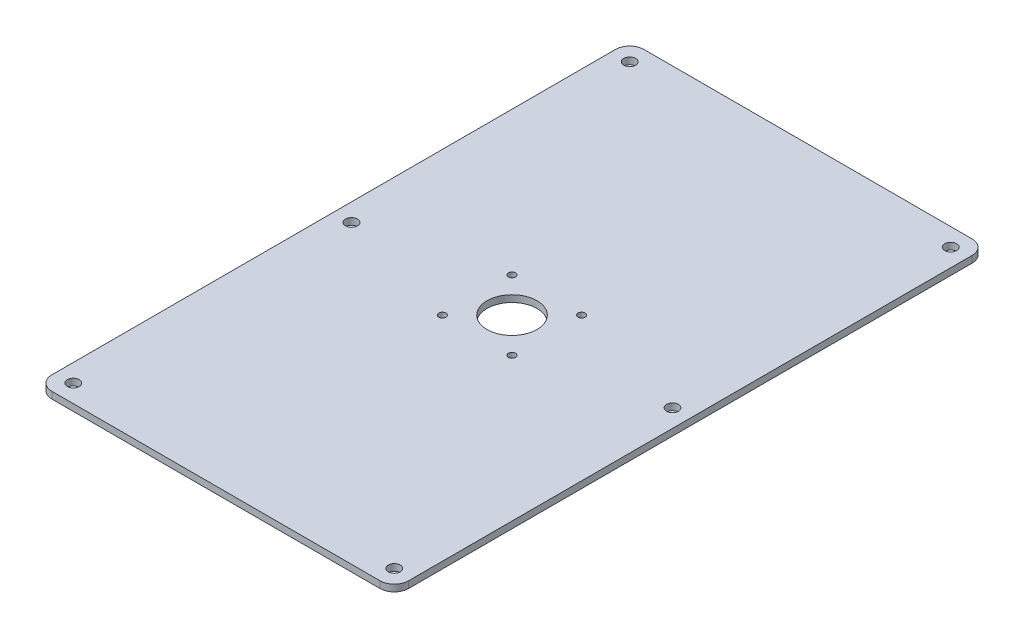
ISO-10303-21;
HEADER;
FILE_DESCRIPTION(('STEP AP214'),'2;1');
FILE_NAME('part.step','',(''),(''),'','','');
FILE_SCHEMA(('AUTOMOTIVE_DESIGN { 1 0 10303 214 1 1 1 1 }'));
ENDSEC;
DATA;
#1=APPLICATION_CONTEXT('core data for automotive mechanical design processes');
#2=APPLICATION_PROTOCOL_DEFINITION('international standard','automotive_design',2000,#1);
#3=PRODUCT_CONTEXT('',#1,'mechanical');
#4=PRODUCT('Part','Part','',(#3));
#5=PRODUCT_RELATED_PRODUCT_CATEGORY('part','',(#4));
#6=PRODUCT_DEFINITION_FORMATION('','',#4);
#7=PRODUCT_DEFINITION_CONTEXT('part definition',#1,'design');
#8=PRODUCT_DEFINITION('design','',#6,#7);
#9=PRODUCT_DEFINITION_SHAPE('','',#8);
#10=(LENGTH_UNIT() NAMED_UNIT(*) SI_UNIT(.MILLI.,.METRE.));
#11=(NAMED_UNIT(*) PLANE_ANGLE_UNIT() SI_UNIT($,.RADIAN.));
#12=(NAMED_UNIT(*) SI_UNIT($,.STERADIAN.) SOLID_ANGLE_UNIT());
#13=UNCERTAINTY_MEASURE_WITH_UNIT(LENGTH_MEASURE(1.E-05),#10,'distance_accuracy_value','');
#14=(GEOMETRIC_REPRESENTATION_CONTEXT(3) GLOBAL_UNCERTAINTY_ASSIGNED_CONTEXT((#13)) GLOBAL_UNIT_ASSIGNED_CONTEXT((#10,
#11,#12)) REPRESENTATION_CONTEXT('',''));
#15=CARTESIAN_POINT('',(0.,0.,0.));
#16=DIRECTION('',(0.,0.,1.));
#17=DIRECTION('',(1.,0.,0.));
#18=AXIS2_PLACEMENT_3D('',#15,#16,#17);
#19=CARTESIAN_POINT('',(0.,3.,0.));
#20=DIRECTION('',(0.,-1.,0.));
#21=DIRECTION('',(0.,0.,-1.));
#22=AXIS2_PLACEMENT_3D('',#19,#20,#21);
#23=PLANE('',#22);
#24=CARTESIAN_POINT('',(-15.5,3.,15.5));
#25=DIRECTION('',(0.,1.,0.));
#26=DIRECTION('',(0.,0.,1.));
#27=AXIS2_PLACEMENT_3D('',#24,#25,#26);
#28=CIRCLE('',#27,1.6);
#29=CARTESIAN_POINT('',(-15.5,3.,17.1));
#30=VERTEX_POINT('',#29);
#31=EDGE_CURVE('E210',#30,#30,#28,.T.);
#32=ORIENTED_EDGE('',*,*,#31,.F.);
#33=EDGE_LOOP('',(#32));
#34=FACE_BOUND('',#33,.T.);
#35=CARTESIAN_POINT('',(0.,3.,0.));
#36=DIRECTION('',(0.,1.,0.));
#37=DIRECTION('',(0.,0.,1.));
#38=AXIS2_PLACEMENT_3D('',#35,#36,#37);
#39=CIRCLE('',#38,11.1125);
#40=CARTESIAN_POINT('',(0.,3.,11.1125));
#41=VERTEX_POINT('',#40);
#42=EDGE_CURVE('E144',#41,#41,#39,.T.);
#43=ORIENTED_EDGE('',*,*,#42,.F.);
#44=EDGE_LOOP('',(#43));
#45=FACE_BOUND('',#44,.T.);
#46=DIRECTION('',(1.,0.,0.));
#47=VECTOR('',#46,1.);
#48=CARTESIAN_POINT('',(-79.375,3.,131.7625));
#49=LINE('',#48,#47);
#50=CARTESIAN_POINT('',(-73.025,3.,131.7625));
#51=VERTEX_POINT('',#50);
#52=CARTESIAN_POINT('',(73.0249999999999,3.,131.7625));
#53=VERTEX_POINT('',#52);
#54=EDGE_CURVE('E150',#51,#53,#49,.T.);
#55=ORIENTED_EDGE('',*,*,#54,.T.);
#56=CARTESIAN_POINT('',(73.025,3.,125.4125));
#57=DIRECTION('',(0.,-1.,0.));
#58=DIRECTION('',(0.,0.,-1.));
#59=AXIS2_PLACEMENT_3D('',#56,#57,#58);
#60=CIRCLE('',#59,6.35);
#61=CARTESIAN_POINT('',(79.375,3.,125.4125));
#62=VERTEX_POINT('',#61);
#63=EDGE_CURVE('E164',#53,#62,#60,.F.);
#64=ORIENTED_EDGE('',*,*,#63,.T.);
#65=DIRECTION('',(0.,0.,-1.));
#66=VECTOR('',#65,1.);
#67=CARTESIAN_POINT('',(79.375,3.,131.7625));
#68=LINE('',#67,#66);
#69=CARTESIAN_POINT('',(79.375,3.,-125.4125));
#70=VERTEX_POINT('',#69);
#71=EDGE_CURVE('E128',#62,#70,#68,.T.);
#72=ORIENTED_EDGE('',*,*,#71,.T.);
#73=CARTESIAN_POINT('',(73.025,3.,-125.4125));
#74=DIRECTION('',(0.,-1.,0.));
#75=DIRECTION('',(0.,0.,-1.));
#76=AXIS2_PLACEMENT_3D('',#73,#74,#75);
#77=CIRCLE('',#76,6.35);
#78=CARTESIAN_POINT('',(73.0249999999999,3.,-131.7625));
#79=VERTEX_POINT('',#78);
#80=EDGE_CURVE('E162',#70,#79,#77,.F.);
#81=ORIENTED_EDGE('',*,*,#80,.T.);
#82=DIRECTION('',(-1.,0.,0.));
#83=VECTOR('',#82,1.);
#84=CARTESIAN_POINT('',(-79.375,3.,-131.7625));
#85=LINE('',#84,#83);
#86=CARTESIAN_POINT('',(-73.025,3.,-131.7625));
#87=VERTEX_POINT('',#86);
#88=EDGE_CURVE('E176',#79,#87,#85,.T.);
#89=ORIENTED_EDGE('',*,*,#88,.T.);
#90=CARTESIAN_POINT('',(-73.025,3.,-125.4125));
#91=DIRECTION('',(0.,-1.,0.));
#92=DIRECTION('',(0.,0.,-1.));
#93=AXIS2_PLACEMENT_3D('',#90,#91,#92);
#94=CIRCLE('',#93,6.35);
#95=CARTESIAN_POINT('',(-79.375,3.,-125.4125));
#96=VERTEX_POINT('',#95);
#97=EDGE_CURVE('E69',#87,#96,#94,.F.);
#98=ORIENTED_EDGE('',*,*,#97,.T.);
#99=DIRECTION('',(0.,0.,1.));
#100=VECTOR('',#99,1.);
#101=CARTESIAN_POINT('',(-79.375,3.,131.7625));
#102=LINE('',#101,#100);
#103=CARTESIAN_POINT('',(-79.375,3.,125.4125));
#104=VERTEX_POINT('',#103);
#105=EDGE_CURVE('E183',#96,#104,#102,.T.);
#106=ORIENTED_EDGE('',*,*,#105,.T.);
#107=CARTESIAN_POINT('',(-73.025,3.,125.4125));
#108=DIRECTION('',(0.,-1.,0.));
#109=DIRECTION('',(0.,0.,-1.));
#110=AXIS2_PLACEMENT_3D('',#107,#108,#109);
#111=CIRCLE('',#110,6.35);
#112=EDGE_CURVE('E159',#104,#51,#111,.F.);
#113=ORIENTED_EDGE('',*,*,#112,.T.);
#114=EDGE_LOOP('',(#55,#64,#72,#81,#89,#98,#106,#113));
#115=FACE_BOUND('',#114,.T.);
#116=CARTESIAN_POINT('',(15.5,3.,15.5));
#117=DIRECTION('',(0.,1.,0.));
#118=DIRECTION('',(0.,0.,1.));
#119=AXIS2_PLACEMENT_3D('',#116,#117,#118);
#120=CIRCLE('',#119,1.6);
#121=CARTESIAN_POINT('',(15.5,3.,17.1));
#122=VERTEX_POINT('',#121);
#123=EDGE_CURVE('E193',#122,#122,#120,.T.);
#124=ORIENTED_EDGE('',*,*,#123,.F.);
#125=EDGE_LOOP('',(#124));
#126=FACE_BOUND('',#125,.T.);
#127=CARTESIAN_POINT('',(-15.5,3.,-15.5));
#128=DIRECTION('',(0.,1.,0.));
#129=DIRECTION('',(0.,0.,1.));
#130=AXIS2_PLACEMENT_3D('',#127,#128,#129);
#131=CIRCLE('',#130,1.6);
#132=CARTESIAN_POINT('',(-15.5,3.,-13.9));
#133=VERTEX_POINT('',#132);
#134=EDGE_CURVE('E202',#133,#133,#131,.T.);
#135=ORIENTED_EDGE('',*,*,#134,.F.);
#136=EDGE_LOOP('',(#135));
#137=FACE_BOUND('',#136,.T.);
#138=CARTESIAN_POINT('',(15.5,3.,-15.5));
#139=DIRECTION('',(0.,1.,0.));
#140=DIRECTION('',(0.,0.,1.));
#141=AXIS2_PLACEMENT_3D('',#138,#139,#140);
#142=CIRCLE('',#141,1.6);
#143=CARTESIAN_POINT('',(15.5,3.,-13.9));
#144=VERTEX_POINT('',#143);
#145=EDGE_CURVE('E214',#144,#144,#142,.T.);
#146=ORIENTED_EDGE('',*,*,#145,.F.);
#147=EDGE_LOOP('',(#146));
#148=FACE_BOUND('',#147,.T.);
#149=CARTESIAN_POINT('',(71.4375,3.,0.));
#150=DIRECTION('',(0.,1.,0.));
#151=DIRECTION('',(0.,0.,1.));
#152=AXIS2_PLACEMENT_3D('',#149,#150,#151);
#153=CIRCLE('',#152,2.65);
#154=CARTESIAN_POINT('',(71.4375,3.,2.65));
#155=VERTEX_POINT('',#154);
#156=EDGE_CURVE('E218',#155,#155,#153,.T.);
#157=ORIENTED_EDGE('',*,*,#156,.F.);
#158=EDGE_LOOP('',(#157));
#159=FACE_BOUND('',#158,.T.);
#160=CARTESIAN_POINT('',(-71.4375,3.,0.));
#161=DIRECTION('',(0.,1.,0.));
#162=DIRECTION('',(0.,0.,1.));
#163=AXIS2_PLACEMENT_3D('',#160,#161,#162);
#164=CIRCLE('',#163,2.65);
#165=CARTESIAN_POINT('',(-71.4375,3.,2.65));
#166=VERTEX_POINT('',#165);
#167=EDGE_CURVE('E224',#166,#166,#164,.T.);
#168=ORIENTED_EDGE('',*,*,#167,.F.);
#169=EDGE_LOOP('',(#168));
#170=FACE_BOUND('',#169,.T.);
#171=CARTESIAN_POINT('',(71.4375,3.,123.825));
#172=DIRECTION('',(0.,1.,0.));
#173=DIRECTION('',(0.,0.,1.));
#174=AXIS2_PLACEMENT_3D('',#171,#172,#173);
#175=CIRCLE('',#174,2.65);
#176=CARTESIAN_POINT('',(71.4375,3.,126.475));
#177=VERTEX_POINT('',#176);
#178=EDGE_CURVE('E233',#177,#177,#175,.T.);
#179=ORIENTED_EDGE('',*,*,#178,.F.);
#180=EDGE_LOOP('',(#179));
#181=FACE_BOUND('',#180,.T.);
#182=CARTESIAN_POINT('',(-71.4375,3.,-123.825));
#183=DIRECTION('',(0.,1.,0.));
#184=DIRECTION('',(0.,0.,1.));
#185=AXIS2_PLACEMENT_3D('',#182,#183,#184);
#186=CIRCLE('',#185,2.65);
#187=CARTESIAN_POINT('',(-71.4375,3.,-121.175));
#188=VERTEX_POINT('',#187);
#189=EDGE_CURVE('E240',#188,#188,#186,.T.);
#190=ORIENTED_EDGE('',*,*,#189,.F.);
#191=EDGE_LOOP('',(#190));
#192=FACE_BOUND('',#191,.T.);
#193=CARTESIAN_POINT('',(-71.4375,3.,123.825));
#194=DIRECTION('',(0.,1.,0.));
#195=DIRECTION('',(0.,0.,1.));
#196=AXIS2_PLACEMENT_3D('',#193,#194,#195);
#197=CIRCLE('',#196,2.65);
#198=CARTESIAN_POINT('',(-71.4375,3.,126.475));
#199=VERTEX_POINT('',#198);
#200=EDGE_CURVE('E243',#199,#199,#197,.T.);
#201=ORIENTED_EDGE('',*,*,#200,.F.);
#202=EDGE_LOOP('',(#201));
#203=FACE_BOUND('',#202,.T.);
#204=CARTESIAN_POINT('',(71.4375,3.,-123.825));
#205=DIRECTION('',(0.,1.,0.));
#206=DIRECTION('',(0.,0.,1.));
#207=AXIS2_PLACEMENT_3D('',#204,#205,#206);
#208=CIRCLE('',#207,2.65);
#209=CARTESIAN_POINT('',(71.4375,3.,-121.175));
#210=VERTEX_POINT('',#209);
#211=EDGE_CURVE('E248',#210,#210,#208,.T.);
#212=ORIENTED_EDGE('',*,*,#211,.F.);
#213=EDGE_LOOP('',(#212));
#214=FACE_BOUND('',#213,.T.);
#215=ADVANCED_FACE('F42',(#34,#45,#115,#126,#137,#148,#159,#170,#181,#192,#203,#214),#23,.F.);
#216=CARTESIAN_POINT('',(79.375,3.,131.7625));
#217=DIRECTION('',(-1.,0.,0.));
#218=DIRECTION('',(0.,0.,1.));
#219=AXIS2_PLACEMENT_3D('',#216,#217,#218);
#220=PLANE('',#219);
#221=ORIENTED_EDGE('',*,*,#71,.F.);
#222=DIRECTION('',(0.,-1.,0.));
#223=VECTOR('',#222,1.);
#224=CARTESIAN_POINT('',(79.375,3.,125.4125));
#225=LINE('',#224,#223);
#226=CARTESIAN_POINT('',(79.375,0.,125.4125));
#227=VERTEX_POINT('',#226);
#228=EDGE_CURVE('E112',#62,#227,#225,.T.);
#229=ORIENTED_EDGE('',*,*,#228,.T.);
#230=DIRECTION('',(0.,0.,-1.));
#231=VECTOR('',#230,1.);
#232=CARTESIAN_POINT('',(79.375,0.,131.7625));
#233=LINE('',#232,#231);
#234=CARTESIAN_POINT('',(79.375,0.,-125.4125));
#235=VERTEX_POINT('',#234);
#236=EDGE_CURVE('E130',#227,#235,#233,.T.);
#237=ORIENTED_EDGE('',*,*,#236,.T.);
#238=DIRECTION('',(0.,-1.,0.));
#239=VECTOR('',#238,1.);
#240=CARTESIAN_POINT('',(79.375,3.,-125.4125));
#241=LINE('',#240,#239);
#242=EDGE_CURVE('E131',#235,#70,#241,.F.);
#243=ORIENTED_EDGE('',*,*,#242,.T.);
#244=EDGE_LOOP('',(#221,#229,#237,#243));
#245=FACE_BOUND('',#244,.T.);
#246=ADVANCED_FACE('F127',(#245),#220,.F.);
#247=CARTESIAN_POINT('',(-79.375,3.,-131.7625));
#248=DIRECTION('',(0.,0.,1.));
#249=DIRECTION('',(1.,0.,0.));
#250=AXIS2_PLACEMENT_3D('',#247,#248,#249);
#251=PLANE('',#250);
#252=DIRECTION('',(-1.,0.,0.));
#253=VECTOR('',#252,1.);
#254=CARTESIAN_POINT('',(-79.375,0.,-131.7625));
#255=LINE('',#254,#253);
#256=CARTESIAN_POINT('',(73.0249999999999,0.,-131.7625));
#257=VERTEX_POINT('',#256);
#258=CARTESIAN_POINT('',(-73.025,0.,-131.7625));
#259=VERTEX_POINT('',#258);
#260=EDGE_CURVE('E140',#257,#259,#255,.T.);
#261=ORIENTED_EDGE('',*,*,#260,.T.);
#262=DIRECTION('',(0.,-1.,0.));
#263=VECTOR('',#262,1.);
#264=CARTESIAN_POINT('',(-73.025,3.,-131.7625));
#265=LINE('',#264,#263);
#266=EDGE_CURVE('E11',#259,#87,#265,.F.);
#267=ORIENTED_EDGE('',*,*,#266,.T.);
#268=ORIENTED_EDGE('',*,*,#88,.F.);
#269=DIRECTION('',(0.,-1.,0.));
#270=VECTOR('',#269,1.);
#271=CARTESIAN_POINT('',(73.025,3.,-131.7625));
#272=LINE('',#271,#270);
#273=EDGE_CURVE('E55',#79,#257,#272,.T.);
#274=ORIENTED_EDGE('',*,*,#273,.T.);
#275=EDGE_LOOP('',(#261,#267,#268,#274));
#276=FACE_BOUND('',#275,.T.);
#277=ADVANCED_FACE('F172',(#276),#251,.F.);
#278=CARTESIAN_POINT('',(-79.375,3.,131.7625));
#279=DIRECTION('',(1.,0.,0.));
#280=DIRECTION('',(0.,0.,-1.));
#281=AXIS2_PLACEMENT_3D('',#278,#279,#280);
#282=PLANE('',#281);
#283=ORIENTED_EDGE('',*,*,#105,.F.);
#284=DIRECTION('',(0.,-1.,0.));
#285=VECTOR('',#284,1.);
#286=CARTESIAN_POINT('',(-79.375,3.,-125.4125));
#287=LINE('',#286,#285);
#288=CARTESIAN_POINT('',(-79.375,0.,-125.4125));
#289=VERTEX_POINT('',#288);
#290=EDGE_CURVE('E166',#96,#289,#287,.T.);
#291=ORIENTED_EDGE('',*,*,#290,.T.);
#292=DIRECTION('',(0.,0.,1.));
#293=VECTOR('',#292,1.);
#294=CARTESIAN_POINT('',(-79.375,0.,131.7625));
#295=LINE('',#294,#293);
#296=CARTESIAN_POINT('',(-79.375,0.,125.4125));
#297=VERTEX_POINT('',#296);
#298=EDGE_CURVE('E142',#289,#297,#295,.T.);
#299=ORIENTED_EDGE('',*,*,#298,.T.);
#300=DIRECTION('',(0.,-1.,0.));
#301=VECTOR('',#300,1.);
#302=CARTESIAN_POINT('',(-79.375,3.,125.4125));
#303=LINE('',#302,#301);
#304=EDGE_CURVE('E56',#297,#104,#303,.F.);
#305=ORIENTED_EDGE('',*,*,#304,.T.);
#306=EDGE_LOOP('',(#283,#291,#299,#305));
#307=FACE_BOUND('',#306,.T.);
#308=ADVANCED_FACE('F182',(#307),#282,.F.);
#309=CARTESIAN_POINT('',(-79.375,3.,131.7625));
#310=DIRECTION('',(0.,0.,-1.));
#311=DIRECTION('',(-1.,0.,0.));
#312=AXIS2_PLACEMENT_3D('',#309,#310,#311);
#313=PLANE('',#312);
#314=DIRECTION('',(1.,0.,0.));
#315=VECTOR('',#314,1.);
#316=CARTESIAN_POINT('',(-79.375,0.,131.7625));
#317=LINE('',#316,#315);
#318=CARTESIAN_POINT('',(-73.025,0.,131.7625));
#319=VERTEX_POINT('',#318);
#320=CARTESIAN_POINT('',(73.0249999999999,0.,131.7625));
#321=VERTEX_POINT('',#320);
#322=EDGE_CURVE('E154',#319,#321,#317,.T.);
#323=ORIENTED_EDGE('',*,*,#322,.T.);
#324=DIRECTION('',(0.,-1.,0.));
#325=VECTOR('',#324,1.);
#326=CARTESIAN_POINT('',(73.025,3.,131.7625));
#327=LINE('',#326,#325);
#328=EDGE_CURVE('E114',#321,#53,#327,.F.);
#329=ORIENTED_EDGE('',*,*,#328,.T.);
#330=ORIENTED_EDGE('',*,*,#54,.F.);
#331=DIRECTION('',(0.,-1.,0.));
#332=VECTOR('',#331,1.);
#333=CARTESIAN_POINT('',(-73.025,3.,131.7625));
#334=LINE('',#333,#332);
#335=EDGE_CURVE('E119',#51,#319,#334,.T.);
#336=ORIENTED_EDGE('',*,*,#335,.T.);
#337=EDGE_LOOP('',(#323,#329,#330,#336));
#338=FACE_BOUND('',#337,.T.);
#339=ADVANCED_FACE('F275',(#338),#313,.F.);
#340=CARTESIAN_POINT('',(0.,0.,0.));
#341=DIRECTION('',(0.,-1.,0.));
#342=DIRECTION('',(0.,0.,-1.));
#343=AXIS2_PLACEMENT_3D('',#340,#341,#342);
#344=PLANE('',#343);
#345=CARTESIAN_POINT('',(71.4375,0.,-123.825));
#346=DIRECTION('',(0.,-1.,0.));
#347=DIRECTION('',(0.,0.,-1.));
#348=AXIS2_PLACEMENT_3D('',#345,#346,#347);
#349=CIRCLE('',#348,2.65);
#350=CARTESIAN_POINT('',(71.4375,0.,-126.475));
#351=VERTEX_POINT('',#350);
#352=EDGE_CURVE('E246',#351,#351,#349,.T.);
#353=ORIENTED_EDGE('',*,*,#352,.F.);
#354=EDGE_LOOP('',(#353));
#355=FACE_BOUND('',#354,.T.);
#356=CARTESIAN_POINT('',(-71.4375,0.,123.825));
#357=DIRECTION('',(0.,-1.,0.));
#358=DIRECTION('',(0.,0.,-1.));
#359=AXIS2_PLACEMENT_3D('',#356,#357,#358);
#360=CIRCLE('',#359,2.65);
#361=CARTESIAN_POINT('',(-71.4375,0.,121.175));
#362=VERTEX_POINT('',#361);
#363=EDGE_CURVE('E239',#362,#362,#360,.T.);
#364=ORIENTED_EDGE('',*,*,#363,.F.);
#365=EDGE_LOOP('',(#364));
#366=FACE_BOUND('',#365,.T.);
#367=CARTESIAN_POINT('',(-71.4375,0.,-123.825));
#368=DIRECTION('',(0.,-1.,0.));
#369=DIRECTION('',(0.,0.,-1.));
#370=AXIS2_PLACEMENT_3D('',#367,#368,#369);
#371=CIRCLE('',#370,2.65);
#372=CARTESIAN_POINT('',(-71.4375,0.,-126.475));
#373=VERTEX_POINT('',#372);
#374=EDGE_CURVE('E234',#373,#373,#371,.T.);
#375=ORIENTED_EDGE('',*,*,#374,.F.);
#376=EDGE_LOOP('',(#375));
#377=FACE_BOUND('',#376,.T.);
#378=CARTESIAN_POINT('',(71.4375,0.,123.825));
#379=DIRECTION('',(0.,-1.,0.));
#380=DIRECTION('',(0.,0.,-1.));
#381=AXIS2_PLACEMENT_3D('',#378,#379,#380);
#382=CIRCLE('',#381,2.65);
#383=CARTESIAN_POINT('',(71.4375,0.,121.175));
#384=VERTEX_POINT('',#383);
#385=EDGE_CURVE('E226',#384,#384,#382,.T.);
#386=ORIENTED_EDGE('',*,*,#385,.F.);
#387=EDGE_LOOP('',(#386));
#388=FACE_BOUND('',#387,.T.);
#389=CARTESIAN_POINT('',(-71.4375,0.,0.));
#390=DIRECTION('',(0.,-1.,0.));
#391=DIRECTION('',(0.,0.,-1.));
#392=AXIS2_PLACEMENT_3D('',#389,#390,#391);
#393=CIRCLE('',#392,2.65);
#394=CARTESIAN_POINT('',(-71.4375,0.,-2.65));
#395=VERTEX_POINT('',#394);
#396=EDGE_CURVE('E225',#395,#395,#393,.T.);
#397=ORIENTED_EDGE('',*,*,#396,.F.);
#398=EDGE_LOOP('',(#397));
#399=FACE_BOUND('',#398,.T.);
#400=CARTESIAN_POINT('',(71.4375,0.,0.));
#401=DIRECTION('',(0.,-1.,0.));
#402=DIRECTION('',(0.,0.,-1.));
#403=AXIS2_PLACEMENT_3D('',#400,#401,#402);
#404=CIRCLE('',#403,2.65);
#405=CARTESIAN_POINT('',(71.4375,0.,-2.65));
#406=VERTEX_POINT('',#405);
#407=EDGE_CURVE('E219',#406,#406,#404,.T.);
#408=ORIENTED_EDGE('',*,*,#407,.F.);
#409=EDGE_LOOP('',(#408));
#410=FACE_BOUND('',#409,.T.);
#411=CARTESIAN_POINT('',(15.5,0.,-15.5));
#412=DIRECTION('',(0.,-1.,0.));
#413=DIRECTION('',(0.,0.,-1.));
#414=AXIS2_PLACEMENT_3D('',#411,#412,#413);
#415=CIRCLE('',#414,1.6);
#416=CARTESIAN_POINT('',(15.5,0.,-17.1));
#417=VERTEX_POINT('',#416);
#418=EDGE_CURVE('E208',#417,#417,#415,.T.);
#419=ORIENTED_EDGE('',*,*,#418,.F.);
#420=EDGE_LOOP('',(#419));
#421=FACE_BOUND('',#420,.T.);
#422=CARTESIAN_POINT('',(-15.5,0.,15.5));
#423=DIRECTION('',(0.,-1.,0.));
#424=DIRECTION('',(0.,0.,-1.));
#425=AXIS2_PLACEMENT_3D('',#422,#423,#424);
#426=CIRCLE('',#425,1.6);
#427=CARTESIAN_POINT('',(-15.5,0.,13.9));
#428=VERTEX_POINT('',#427);
#429=EDGE_CURVE('E204',#428,#428,#426,.T.);
#430=ORIENTED_EDGE('',*,*,#429,.F.);
#431=EDGE_LOOP('',(#430));
#432=FACE_BOUND('',#431,.T.);
#433=CARTESIAN_POINT('',(-15.5,0.,-15.5));
#434=DIRECTION('',(0.,-1.,0.));
#435=DIRECTION('',(0.,0.,-1.));
#436=AXIS2_PLACEMENT_3D('',#433,#434,#435);
#437=CIRCLE('',#436,1.6);
#438=CARTESIAN_POINT('',(-15.5,0.,-17.1));
#439=VERTEX_POINT('',#438);
#440=EDGE_CURVE('E200',#439,#439,#437,.T.);
#441=ORIENTED_EDGE('',*,*,#440,.F.);
#442=EDGE_LOOP('',(#441));
#443=FACE_BOUND('',#442,.T.);
#444=CARTESIAN_POINT('',(15.5,0.,15.5));
#445=DIRECTION('',(0.,-1.,0.));
#446=DIRECTION('',(0.,0.,-1.));
#447=AXIS2_PLACEMENT_3D('',#444,#445,#446);
#448=CIRCLE('',#447,1.6);
#449=CARTESIAN_POINT('',(15.5,0.,13.9));
#450=VERTEX_POINT('',#449);
#451=EDGE_CURVE('E192',#450,#450,#448,.T.);
#452=ORIENTED_EDGE('',*,*,#451,.F.);
#453=EDGE_LOOP('',(#452));
#454=FACE_BOUND('',#453,.T.);
#455=CARTESIAN_POINT('',(0.,0.,0.));
#456=DIRECTION('',(0.,1.,0.));
#457=DIRECTION('',(0.,0.,1.));
#458=AXIS2_PLACEMENT_3D('',#455,#456,#457);
#459=CIRCLE('',#458,11.1125);
#460=CARTESIAN_POINT('',(0.,0.,11.1125));
#461=VERTEX_POINT('',#460);
#462=EDGE_CURVE('E138',#461,#461,#459,.T.);
#463=ORIENTED_EDGE('',*,*,#462,.T.);
#464=EDGE_LOOP('',(#463));
#465=FACE_BOUND('',#464,.T.);
#466=ORIENTED_EDGE('',*,*,#236,.F.);
#467=CARTESIAN_POINT('',(73.025,0.,125.4125));
#468=DIRECTION('',(0.,-1.,0.));
#469=DIRECTION('',(0.,0.,-1.));
#470=AXIS2_PLACEMENT_3D('',#467,#468,#469);
#471=CIRCLE('',#470,6.35);
#472=EDGE_CURVE('E109',#227,#321,#471,.T.);
#473=ORIENTED_EDGE('',*,*,#472,.T.);
#474=ORIENTED_EDGE('',*,*,#322,.F.);
#475=CARTESIAN_POINT('',(-73.025,0.,125.4125));
#476=DIRECTION('',(0.,-1.,0.));
#477=DIRECTION('',(0.,0.,-1.));
#478=AXIS2_PLACEMENT_3D('',#475,#476,#477);
#479=CIRCLE('',#478,6.35);
#480=EDGE_CURVE('E134',#319,#297,#479,.T.);
#481=ORIENTED_EDGE('',*,*,#480,.T.);
#482=ORIENTED_EDGE('',*,*,#298,.F.);
#483=CARTESIAN_POINT('',(-73.025,0.,-125.4125));
#484=DIRECTION('',(0.,-1.,0.));
#485=DIRECTION('',(0.,0.,-1.));
#486=AXIS2_PLACEMENT_3D('',#483,#484,#485);
#487=CIRCLE('',#486,6.35);
#488=EDGE_CURVE('E122',#289,#259,#487,.T.);
#489=ORIENTED_EDGE('',*,*,#488,.T.);
#490=ORIENTED_EDGE('',*,*,#260,.F.);
#491=CARTESIAN_POINT('',(73.025,0.,-125.4125));
#492=DIRECTION('',(0.,-1.,0.));
#493=DIRECTION('',(0.,0.,-1.));
#494=AXIS2_PLACEMENT_3D('',#491,#492,#493);
#495=CIRCLE('',#494,6.35);
#496=EDGE_CURVE('E137',#257,#235,#495,.T.);
#497=ORIENTED_EDGE('',*,*,#496,.T.);
#498=EDGE_LOOP('',(#466,#473,#474,#481,#482,#489,#490,#497));
#499=FACE_BOUND('',#498,.T.);
#500=ADVANCED_FACE('F133',(#355,#366,#377,#388,#399,#410,#421,#432,#443,#454,#465,#499),#344,.T.);
#501=CARTESIAN_POINT('',(0.,0.,0.));
#502=DIRECTION('',(0.,1.,0.));
#503=DIRECTION('',(0.,0.,1.));
#504=AXIS2_PLACEMENT_3D('',#501,#502,#503);
#505=CYLINDRICAL_SURFACE('',#504,11.1125);
#506=ORIENTED_EDGE('',*,*,#462,.F.);
#507=EDGE_LOOP('',(#506));
#508=FACE_BOUND('',#507,.T.);
#509=ORIENTED_EDGE('',*,*,#42,.T.);
#510=EDGE_LOOP('',(#509));
#511=FACE_BOUND('',#510,.T.);
#512=ADVANCED_FACE('F268',(#508,#511),#505,.F.);
#513=CARTESIAN_POINT('',(15.5,3.,15.5));
#514=DIRECTION('',(0.,1.,0.));
#515=DIRECTION('',(0.,0.,1.));
#516=AXIS2_PLACEMENT_3D('',#513,#514,#515);
#517=CYLINDRICAL_SURFACE('',#516,1.6);
#518=ORIENTED_EDGE('',*,*,#123,.T.);
#519=EDGE_LOOP('',(#518));
#520=FACE_BOUND('',#519,.T.);
#521=ORIENTED_EDGE('',*,*,#451,.T.);
#522=EDGE_LOOP('',(#521));
#523=FACE_BOUND('',#522,.T.);
#524=ADVANCED_FACE('F340',(#520,#523),#517,.F.);
#525=CARTESIAN_POINT('',(-15.5,3.,-15.5));
#526=DIRECTION('',(0.,1.,0.));
#527=DIRECTION('',(0.,0.,1.));
#528=AXIS2_PLACEMENT_3D('',#525,#526,#527);
#529=CYLINDRICAL_SURFACE('',#528,1.6);
#530=ORIENTED_EDGE('',*,*,#134,.T.);
#531=EDGE_LOOP('',(#530));
#532=FACE_BOUND('',#531,.T.);
#533=ORIENTED_EDGE('',*,*,#440,.T.);
#534=EDGE_LOOP('',(#533));
#535=FACE_BOUND('',#534,.T.);
#536=ADVANCED_FACE('F345',(#532,#535),#529,.F.);
#537=CARTESIAN_POINT('',(-15.5,3.,15.5));
#538=DIRECTION('',(0.,1.,0.));
#539=DIRECTION('',(0.,0.,1.));
#540=AXIS2_PLACEMENT_3D('',#537,#538,#539);
#541=CYLINDRICAL_SURFACE('',#540,1.6);
#542=ORIENTED_EDGE('',*,*,#31,.T.);
#543=EDGE_LOOP('',(#542));
#544=FACE_BOUND('',#543,.T.);
#545=ORIENTED_EDGE('',*,*,#429,.T.);
#546=EDGE_LOOP('',(#545));
#547=FACE_BOUND('',#546,.T.);
#548=ADVANCED_FACE('F346',(#544,#547),#541,.F.);
#549=CARTESIAN_POINT('',(15.5,3.,-15.5));
#550=DIRECTION('',(0.,1.,0.));
#551=DIRECTION('',(0.,0.,1.));
#552=AXIS2_PLACEMENT_3D('',#549,#550,#551);
#553=CYLINDRICAL_SURFACE('',#552,1.6);
#554=ORIENTED_EDGE('',*,*,#145,.T.);
#555=EDGE_LOOP('',(#554));
#556=FACE_BOUND('',#555,.T.);
#557=ORIENTED_EDGE('',*,*,#418,.T.);
#558=EDGE_LOOP('',(#557));
#559=FACE_BOUND('',#558,.T.);
#560=ADVANCED_FACE('F352',(#556,#559),#553,.F.);
#561=CARTESIAN_POINT('',(71.4375,3.,0.));
#562=DIRECTION('',(0.,1.,0.));
#563=DIRECTION('',(0.,0.,1.));
#564=AXIS2_PLACEMENT_3D('',#561,#562,#563);
#565=CYLINDRICAL_SURFACE('',#564,2.65);
#566=ORIENTED_EDGE('',*,*,#156,.T.);
#567=EDGE_LOOP('',(#566));
#568=FACE_BOUND('',#567,.T.);
#569=ORIENTED_EDGE('',*,*,#407,.T.);
#570=EDGE_LOOP('',(#569));
#571=FACE_BOUND('',#570,.T.);
#572=ADVANCED_FACE('F356',(#568,#571),#565,.F.);
#573=CARTESIAN_POINT('',(-71.4375,3.,0.));
#574=DIRECTION('',(0.,1.,0.));
#575=DIRECTION('',(0.,0.,1.));
#576=AXIS2_PLACEMENT_3D('',#573,#574,#575);
#577=CYLINDRICAL_SURFACE('',#576,2.65);
#578=ORIENTED_EDGE('',*,*,#167,.T.);
#579=EDGE_LOOP('',(#578));
#580=FACE_BOUND('',#579,.T.);
#581=ORIENTED_EDGE('',*,*,#396,.T.);
#582=EDGE_LOOP('',(#581));
#583=FACE_BOUND('',#582,.T.);
#584=ADVANCED_FACE('F365',(#580,#583),#577,.F.);
#585=CARTESIAN_POINT('',(71.4375,3.,123.825));
#586=DIRECTION('',(0.,1.,0.));
#587=DIRECTION('',(0.,0.,1.));
#588=AXIS2_PLACEMENT_3D('',#585,#586,#587);
#589=CYLINDRICAL_SURFACE('',#588,2.65);
#590=ORIENTED_EDGE('',*,*,#178,.T.);
#591=EDGE_LOOP('',(#590));
#592=FACE_BOUND('',#591,.T.);
#593=ORIENTED_EDGE('',*,*,#385,.T.);
#594=EDGE_LOOP('',(#593));
#595=FACE_BOUND('',#594,.T.);
#596=ADVANCED_FACE('F366',(#592,#595),#589,.F.);
#597=CARTESIAN_POINT('',(-71.4375,3.,-123.825));
#598=DIRECTION('',(0.,1.,0.));
#599=DIRECTION('',(0.,0.,1.));
#600=AXIS2_PLACEMENT_3D('',#597,#598,#599);
#601=CYLINDRICAL_SURFACE('',#600,2.65);
#602=ORIENTED_EDGE('',*,*,#189,.T.);
#603=EDGE_LOOP('',(#602));
#604=FACE_BOUND('',#603,.T.);
#605=ORIENTED_EDGE('',*,*,#374,.T.);
#606=EDGE_LOOP('',(#605));
#607=FACE_BOUND('',#606,.T.);
#608=ADVANCED_FACE('F315',(#604,#607),#601,.F.);
#609=CARTESIAN_POINT('',(-71.4375,3.,123.825));
#610=DIRECTION('',(0.,1.,0.));
#611=DIRECTION('',(0.,0.,1.));
#612=AXIS2_PLACEMENT_3D('',#609,#610,#611);
#613=CYLINDRICAL_SURFACE('',#612,2.65);
#614=ORIENTED_EDGE('',*,*,#200,.T.);
#615=EDGE_LOOP('',(#614));
#616=FACE_BOUND('',#615,.T.);
#617=ORIENTED_EDGE('',*,*,#363,.T.);
#618=EDGE_LOOP('',(#617));
#619=FACE_BOUND('',#618,.T.);
#620=ADVANCED_FACE('F307',(#616,#619),#613,.F.);
#621=CARTESIAN_POINT('',(71.4375,3.,-123.825));
#622=DIRECTION('',(0.,1.,0.));
#623=DIRECTION('',(0.,0.,1.));
#624=AXIS2_PLACEMENT_3D('',#621,#622,#623);
#625=CYLINDRICAL_SURFACE('',#624,2.65);
#626=ORIENTED_EDGE('',*,*,#211,.T.);
#627=EDGE_LOOP('',(#626));
#628=FACE_BOUND('',#627,.T.);
#629=ORIENTED_EDGE('',*,*,#352,.T.);
#630=EDGE_LOOP('',(#629));
#631=FACE_BOUND('',#630,.T.);
#632=ADVANCED_FACE('F254',(#628,#631),#625,.F.);
#633=CARTESIAN_POINT('',(73.025,3.,125.4125));
#634=DIRECTION('',(0.,-1.,0.));
#635=DIRECTION('',(0.,0.,-1.));
#636=AXIS2_PLACEMENT_3D('',#633,#634,#635);
#637=CYLINDRICAL_SURFACE('',#636,6.35);
#638=ORIENTED_EDGE('',*,*,#63,.F.);
#639=ORIENTED_EDGE('',*,*,#328,.F.);
#640=ORIENTED_EDGE('',*,*,#472,.F.);
#641=ORIENTED_EDGE('',*,*,#228,.F.);
#642=EDGE_LOOP('',(#638,#639,#640,#641));
#643=FACE_BOUND('',#642,.T.);
#644=ADVANCED_FACE('F113',(#643),#637,.T.);
#645=CARTESIAN_POINT('',(-73.025,3.,-125.4125));
#646=DIRECTION('',(0.,-1.,0.));
#647=DIRECTION('',(0.,0.,-1.));
#648=AXIS2_PLACEMENT_3D('',#645,#646,#647);
#649=CYLINDRICAL_SURFACE('',#648,6.35);
#650=ORIENTED_EDGE('',*,*,#97,.F.);
#651=ORIENTED_EDGE('',*,*,#266,.F.);
#652=ORIENTED_EDGE('',*,*,#488,.F.);
#653=ORIENTED_EDGE('',*,*,#290,.F.);
#654=EDGE_LOOP('',(#650,#651,#652,#653));
#655=FACE_BOUND('',#654,.T.);
#656=ADVANCED_FACE('F185',(#655),#649,.T.);
#657=CARTESIAN_POINT('',(73.025,3.,-125.4125));
#658=DIRECTION('',(0.,-1.,0.));
#659=DIRECTION('',(0.,0.,-1.));
#660=AXIS2_PLACEMENT_3D('',#657,#658,#659);
#661=CYLINDRICAL_SURFACE('',#660,6.35);
#662=ORIENTED_EDGE('',*,*,#80,.F.);
#663=ORIENTED_EDGE('',*,*,#242,.F.);
#664=ORIENTED_EDGE('',*,*,#496,.F.);
#665=ORIENTED_EDGE('',*,*,#273,.F.);
#666=EDGE_LOOP('',(#662,#663,#664,#665));
#667=FACE_BOUND('',#666,.T.);
#668=ADVANCED_FACE('F283',(#667),#661,.T.);
#669=CARTESIAN_POINT('',(-73.025,3.,125.4125));
#670=DIRECTION('',(0.,-1.,0.));
#671=DIRECTION('',(0.,0.,-1.));
#672=AXIS2_PLACEMENT_3D('',#669,#670,#671);
#673=CYLINDRICAL_SURFACE('',#672,6.35);
#674=ORIENTED_EDGE('',*,*,#112,.F.);
#675=ORIENTED_EDGE('',*,*,#304,.F.);
#676=ORIENTED_EDGE('',*,*,#480,.F.);
#677=ORIENTED_EDGE('',*,*,#335,.F.);
#678=EDGE_LOOP('',(#674,#675,#676,#677));
#679=FACE_BOUND('',#678,.T.);
#680=ADVANCED_FACE('F46',(#679),#673,.T.);
#681=CLOSED_SHELL('',(#215,#246,#277,#308,#339,#500,#512,#524,#536,#548,#560,#572,#584,#596,
#608,#620,#632,#644,#656,#668,#680));
#682=MANIFOLD_SOLID_BREP('B2',#681);
#683=ADVANCED_BREP_SHAPE_REPRESENTATION('',(#18,#682),#14);
#684=SHAPE_DEFINITION_REPRESENTATION(#9,#683);
ENDSEC;
END-ISO-10303-21;
